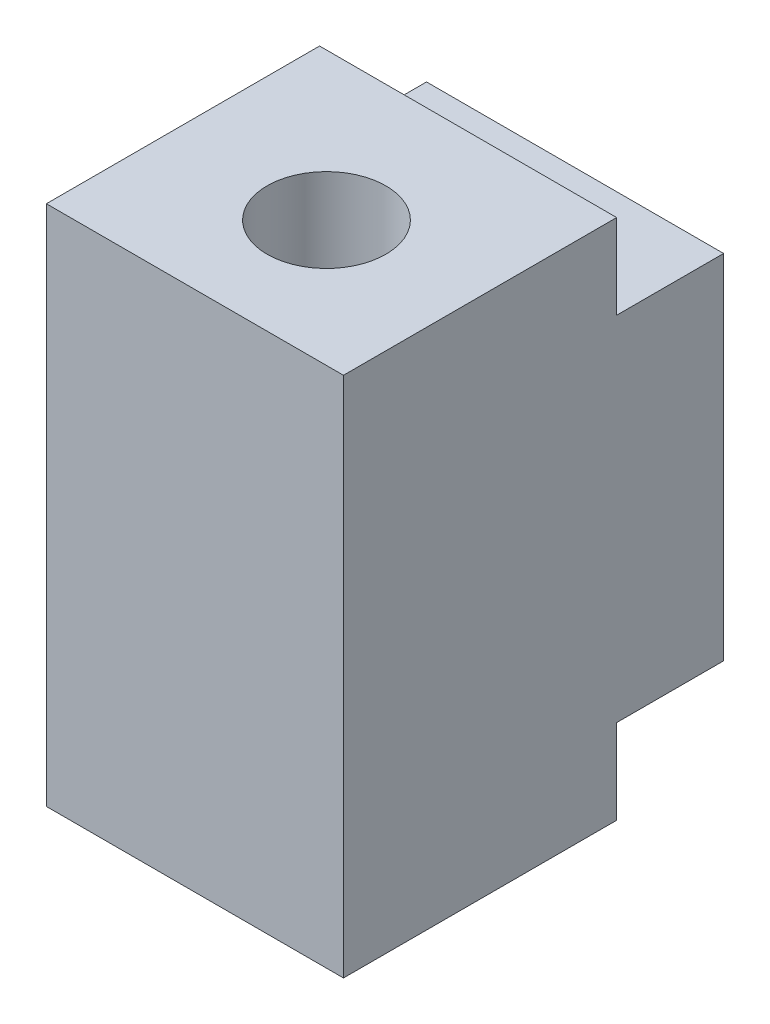
ISO-10303-21;
HEADER;
FILE_DESCRIPTION(('STEP AP214'),'2;1');
FILE_NAME('part.step','',(''),(''),'','','');
FILE_SCHEMA(('AUTOMOTIVE_DESIGN { 1 0 10303 214 1 1 1 1 }'));
ENDSEC;
DATA;
#1=APPLICATION_CONTEXT('core data for automotive mechanical design processes');
#2=APPLICATION_PROTOCOL_DEFINITION('international standard','automotive_design',2000,#1);
#3=PRODUCT_CONTEXT('',#1,'mechanical');
#4=PRODUCT('Part','Part','',(#3));
#5=PRODUCT_RELATED_PRODUCT_CATEGORY('part','',(#4));
#6=PRODUCT_DEFINITION_FORMATION('','',#4);
#7=PRODUCT_DEFINITION_CONTEXT('part definition',#1,'design');
#8=PRODUCT_DEFINITION('design','',#6,#7);
#9=PRODUCT_DEFINITION_SHAPE('','',#8);
#10=(LENGTH_UNIT() NAMED_UNIT(*) SI_UNIT(.MILLI.,.METRE.));
#11=(NAMED_UNIT(*) PLANE_ANGLE_UNIT() SI_UNIT($,.RADIAN.));
#12=(NAMED_UNIT(*) SI_UNIT($,.STERADIAN.) SOLID_ANGLE_UNIT());
#13=UNCERTAINTY_MEASURE_WITH_UNIT(LENGTH_MEASURE(1.E-05),#10,'distance_accuracy_value','');
#14=(GEOMETRIC_REPRESENTATION_CONTEXT(3) GLOBAL_UNCERTAINTY_ASSIGNED_CONTEXT((#13)) GLOBAL_UNIT_ASSIGNED_CONTEXT((#10,
#11,#12)) REPRESENTATION_CONTEXT('',''));
#15=CARTESIAN_POINT('',(0.,0.,0.));
#16=DIRECTION('',(0.,0.,1.));
#17=DIRECTION('',(1.,0.,0.));
#18=AXIS2_PLACEMENT_3D('',#15,#16,#17);
#19=CARTESIAN_POINT('',(-12.4056934631671,-14.1873984347729,30.));
#20=DIRECTION('',(1.,0.,0.));
#21=DIRECTION('',(0.,0.,-1.));
#22=AXIS2_PLACEMENT_3D('',#19,#20,#21);
#23=PLANE('',#22);
#24=DIRECTION('',(0.,0.,-1.));
#25=VECTOR('',#24,1.);
#26=CARTESIAN_POINT('',(-12.4056934631671,-14.1873984347729,30.));
#27=LINE('',#26,#25);
#28=CARTESIAN_POINT('',(-12.4056934631671,-14.1873984347729,8.60586466410496));
#29=VERTEX_POINT('',#28);
#30=CARTESIAN_POINT('',(-12.4056934631671,-14.1873984347729,0.));
#31=VERTEX_POINT('',#30);
#32=EDGE_CURVE('E52',#29,#31,#27,.T.);
#33=ORIENTED_EDGE('',*,*,#32,.F.);
#34=DIRECTION('',(0.,1.,0.));
#35=VECTOR('',#34,1.);
#36=CARTESIAN_POINT('',(-12.4056934631671,21.0063007826136,8.60586466410496));
#37=LINE('',#36,#35);
#38=CARTESIAN_POINT('',(-12.4056934631671,-20.9936992173865,8.60586466410496));
#39=VERTEX_POINT('',#38);
#40=EDGE_CURVE('E126',#39,#29,#37,.T.);
#41=ORIENTED_EDGE('',*,*,#40,.F.);
#42=DIRECTION('',(0.,0.,-1.));
#43=VECTOR('',#42,1.);
#44=CARTESIAN_POINT('',(-12.4056934631671,-20.9936992173865,30.5867015679695));
#45=LINE('',#44,#43);
#46=CARTESIAN_POINT('',(-12.4056934631671,-20.9936992173865,30.5867015679695));
#47=VERTEX_POINT('',#46);
#48=EDGE_CURVE('E109',#47,#39,#45,.T.);
#49=ORIENTED_EDGE('',*,*,#48,.F.);
#50=DIRECTION('',(0.,-1.,0.));
#51=VECTOR('',#50,1.);
#52=CARTESIAN_POINT('',(-12.4056934631671,21.0063007826136,30.5867015679695));
#53=LINE('',#52,#51);
#54=CARTESIAN_POINT('',(-12.4056934631671,21.0063007826136,30.5867015679695));
#55=VERTEX_POINT('',#54);
#56=EDGE_CURVE('E123',#55,#47,#53,.T.);
#57=ORIENTED_EDGE('',*,*,#56,.F.);
#58=DIRECTION('',(0.,0.,1.));
#59=VECTOR('',#58,1.);
#60=CARTESIAN_POINT('',(-12.4056934631671,21.0063007826136,30.5867015679695));
#61=LINE('',#60,#59);
#62=CARTESIAN_POINT('',(-12.4056934631671,21.0063007826136,8.60586466410496));
#63=VERTEX_POINT('',#62);
#64=EDGE_CURVE('E117',#63,#55,#61,.T.);
#65=ORIENTED_EDGE('',*,*,#64,.F.);
#66=CARTESIAN_POINT('',(-12.4056934631671,14.2,8.60586466410496));
#67=VERTEX_POINT('',#66);
#68=EDGE_CURVE('E127',#67,#63,#37,.T.);
#69=ORIENTED_EDGE('',*,*,#68,.F.);
#70=DIRECTION('',(0.,0.,-1.));
#71=VECTOR('',#70,1.);
#72=CARTESIAN_POINT('',(-12.4056934631671,14.2,30.));
#73=LINE('',#72,#71);
#74=CARTESIAN_POINT('',(-12.4056934631671,14.2,0.));
#75=VERTEX_POINT('',#74);
#76=EDGE_CURVE('E166',#67,#75,#73,.T.);
#77=ORIENTED_EDGE('',*,*,#76,.T.);
#78=DIRECTION('',(0.,-1.,0.));
#79=VECTOR('',#78,1.);
#80=CARTESIAN_POINT('',(-12.4056934631671,-14.1873984347729,0.));
#81=LINE('',#80,#79);
#82=EDGE_CURVE('E155',#75,#31,#81,.T.);
#83=ORIENTED_EDGE('',*,*,#82,.T.);
#84=EDGE_LOOP('',(#33,#41,#49,#57,#65,#69,#77,#83));
#85=FACE_BOUND('',#84,.T.);
#86=ADVANCED_FACE('F45',(#85),#23,.F.);
#87=CARTESIAN_POINT('',(-12.4056934631671,-14.1873984347729,30.));
#88=DIRECTION('',(0.,1.,0.));
#89=DIRECTION('',(0.,0.,1.));
#90=AXIS2_PLACEMENT_3D('',#87,#88,#89);
#91=PLANE('',#90);
#92=DIRECTION('',(0.,0.,-1.));
#93=VECTOR('',#92,1.);
#94=CARTESIAN_POINT('',(11.5,-14.1873984347729,30.));
#95=LINE('',#94,#93);
#96=CARTESIAN_POINT('',(11.5,-14.1873984347729,8.60586466410496));
#97=VERTEX_POINT('',#96);
#98=CARTESIAN_POINT('',(11.5,-14.1873984347729,0.));
#99=VERTEX_POINT('',#98);
#100=EDGE_CURVE('E64',#97,#99,#95,.T.);
#101=ORIENTED_EDGE('',*,*,#100,.F.);
#102=DIRECTION('',(-1.,0.,0.));
#103=VECTOR('',#102,1.);
#104=CARTESIAN_POINT('',(-12.4056934631671,-14.1873984347729,8.60586466410496));
#105=LINE('',#104,#103);
#106=EDGE_CURVE('E59',#97,#29,#105,.T.);
#107=ORIENTED_EDGE('',*,*,#106,.T.);
#108=ORIENTED_EDGE('',*,*,#32,.T.);
#109=DIRECTION('',(1.,0.,0.));
#110=VECTOR('',#109,1.);
#111=CARTESIAN_POINT('',(-12.4056934631671,-14.1873984347729,0.));
#112=LINE('',#111,#110);
#113=EDGE_CURVE('E158',#31,#99,#112,.T.);
#114=ORIENTED_EDGE('',*,*,#113,.T.);
#115=EDGE_LOOP('',(#101,#107,#108,#114));
#116=FACE_BOUND('',#115,.T.);
#117=ADVANCED_FACE('F171',(#116),#91,.F.);
#118=CARTESIAN_POINT('',(11.5,-14.1873984347729,30.));
#119=DIRECTION('',(-1.,0.,0.));
#120=DIRECTION('',(0.,-1.,0.));
#121=AXIS2_PLACEMENT_3D('',#118,#119,#120);
#122=PLANE('',#121);
#123=DIRECTION('',(0.,1.,0.));
#124=VECTOR('',#123,1.);
#125=CARTESIAN_POINT('',(11.5,21.0063007826136,8.60586466410496));
#126=LINE('',#125,#124);
#127=CARTESIAN_POINT('',(11.5,-20.9936992173865,8.60586466410496));
#128=VERTEX_POINT('',#127);
#129=EDGE_CURVE('E134',#128,#97,#126,.T.);
#130=ORIENTED_EDGE('',*,*,#129,.T.);
#131=ORIENTED_EDGE('',*,*,#100,.T.);
#132=DIRECTION('',(0.,1.,0.));
#133=VECTOR('',#132,1.);
#134=CARTESIAN_POINT('',(11.5,-14.1873984347729,0.));
#135=LINE('',#134,#133);
#136=CARTESIAN_POINT('',(11.5,14.2,0.));
#137=VERTEX_POINT('',#136);
#138=EDGE_CURVE('E160',#99,#137,#135,.T.);
#139=ORIENTED_EDGE('',*,*,#138,.T.);
#140=DIRECTION('',(0.,0.,-1.));
#141=VECTOR('',#140,1.);
#142=CARTESIAN_POINT('',(11.5,14.2,30.));
#143=LINE('',#142,#141);
#144=CARTESIAN_POINT('',(11.5,14.2,8.60586466410496));
#145=VERTEX_POINT('',#144);
#146=EDGE_CURVE('E168',#145,#137,#143,.T.);
#147=ORIENTED_EDGE('',*,*,#146,.F.);
#148=CARTESIAN_POINT('',(11.5,21.0063007826136,8.60586466410496));
#149=VERTEX_POINT('',#148);
#150=EDGE_CURVE('E146',#145,#149,#126,.T.);
#151=ORIENTED_EDGE('',*,*,#150,.T.);
#152=DIRECTION('',(0.,0.,1.));
#153=VECTOR('',#152,1.);
#154=CARTESIAN_POINT('',(11.5,21.0063007826136,30.5867015679695));
#155=LINE('',#154,#153);
#156=CARTESIAN_POINT('',(11.5,21.0063007826136,30.5867015679695));
#157=VERTEX_POINT('',#156);
#158=EDGE_CURVE('E131',#149,#157,#155,.T.);
#159=ORIENTED_EDGE('',*,*,#158,.T.);
#160=DIRECTION('',(0.,-1.,0.));
#161=VECTOR('',#160,1.);
#162=CARTESIAN_POINT('',(11.5,21.0063007826136,30.5867015679695));
#163=LINE('',#162,#161);
#164=CARTESIAN_POINT('',(11.5,-20.9936992173865,30.5867015679695));
#165=VERTEX_POINT('',#164);
#166=EDGE_CURVE('E142',#157,#165,#163,.T.);
#167=ORIENTED_EDGE('',*,*,#166,.T.);
#168=DIRECTION('',(0.,0.,-1.));
#169=VECTOR('',#168,1.);
#170=CARTESIAN_POINT('',(11.5,-20.9936992173865,30.5867015679695));
#171=LINE('',#170,#169);
#172=EDGE_CURVE('E111',#165,#128,#171,.T.);
#173=ORIENTED_EDGE('',*,*,#172,.T.);
#174=EDGE_LOOP('',(#130,#131,#139,#147,#151,#159,#167,#173));
#175=FACE_BOUND('',#174,.T.);
#176=ADVANCED_FACE('F184',(#175),#122,.F.);
#177=CARTESIAN_POINT('',(-12.4056934631671,14.2,30.));
#178=DIRECTION('',(0.,-1.,0.));
#179=DIRECTION('',(0.,0.,-1.));
#180=AXIS2_PLACEMENT_3D('',#177,#178,#179);
#181=PLANE('',#180);
#182=ORIENTED_EDGE('',*,*,#76,.F.);
#183=DIRECTION('',(1.,0.,0.));
#184=VECTOR('',#183,1.);
#185=CARTESIAN_POINT('',(-12.4056934631671,14.2,8.60586466410496));
#186=LINE('',#185,#184);
#187=EDGE_CURVE('E13',#67,#145,#186,.T.);
#188=ORIENTED_EDGE('',*,*,#187,.T.);
#189=ORIENTED_EDGE('',*,*,#146,.T.);
#190=DIRECTION('',(-1.,0.,0.));
#191=VECTOR('',#190,1.);
#192=CARTESIAN_POINT('',(-12.4056934631671,14.2,0.));
#193=LINE('',#192,#191);
#194=EDGE_CURVE('E163',#137,#75,#193,.T.);
#195=ORIENTED_EDGE('',*,*,#194,.T.);
#196=EDGE_LOOP('',(#182,#188,#189,#195));
#197=FACE_BOUND('',#196,.T.);
#198=ADVANCED_FACE('F180',(#197),#181,.F.);
#199=CARTESIAN_POINT('',(0.,0.,0.));
#200=DIRECTION('',(0.,0.,-1.));
#201=DIRECTION('',(-1.,0.,0.));
#202=AXIS2_PLACEMENT_3D('',#199,#200,#201);
#203=PLANE('',#202);
#204=ORIENTED_EDGE('',*,*,#82,.F.);
#205=ORIENTED_EDGE('',*,*,#194,.F.);
#206=ORIENTED_EDGE('',*,*,#138,.F.);
#207=ORIENTED_EDGE('',*,*,#113,.F.);
#208=EDGE_LOOP('',(#204,#205,#206,#207));
#209=FACE_BOUND('',#208,.T.);
#210=ADVANCED_FACE('F175',(#209),#203,.T.);
#211=CARTESIAN_POINT('',(-12.4056934631671,21.0063007826136,8.60586466410496));
#212=DIRECTION('',(0.,0.,-1.));
#213=DIRECTION('',(0.,1.,0.));
#214=AXIS2_PLACEMENT_3D('',#211,#212,#213);
#215=PLANE('',#214);
#216=ORIENTED_EDGE('',*,*,#106,.F.);
#217=ORIENTED_EDGE('',*,*,#129,.F.);
#218=DIRECTION('',(1.,0.,0.));
#219=VECTOR('',#218,1.);
#220=CARTESIAN_POINT('',(-12.4056934631671,-20.9936992173865,8.60586466410496));
#221=LINE('',#220,#219);
#222=EDGE_CURVE('E116',#39,#128,#221,.T.);
#223=ORIENTED_EDGE('',*,*,#222,.F.);
#224=ORIENTED_EDGE('',*,*,#40,.T.);
#225=EDGE_LOOP('',(#216,#217,#223,#224));
#226=FACE_BOUND('',#225,.T.);
#227=ADVANCED_FACE('F187',(#226),#215,.T.);
#228=ORIENTED_EDGE('',*,*,#187,.F.);
#229=ORIENTED_EDGE('',*,*,#68,.T.);
#230=DIRECTION('',(1.,0.,0.));
#231=VECTOR('',#230,1.);
#232=CARTESIAN_POINT('',(-12.4056934631671,21.0063007826136,8.60586466410496));
#233=LINE('',#232,#231);
#234=EDGE_CURVE('E150',#63,#149,#233,.T.);
#235=ORIENTED_EDGE('',*,*,#234,.T.);
#236=ORIENTED_EDGE('',*,*,#150,.F.);
#237=EDGE_LOOP('',(#228,#229,#235,#236));
#238=FACE_BOUND('',#237,.T.);
#239=ADVANCED_FACE('F189',(#238),#215,.T.);
#240=CARTESIAN_POINT('',(-12.4056934631671,21.0063007826136,30.5867015679695));
#241=DIRECTION('',(0.,0.,1.));
#242=DIRECTION('',(0.,-1.,0.));
#243=AXIS2_PLACEMENT_3D('',#240,#241,#242);
#244=PLANE('',#243);
#245=ORIENTED_EDGE('',*,*,#166,.F.);
#246=DIRECTION('',(1.,0.,0.));
#247=VECTOR('',#246,1.);
#248=CARTESIAN_POINT('',(-12.4056934631671,21.0063007826136,30.5867015679695));
#249=LINE('',#248,#247);
#250=EDGE_CURVE('E130',#55,#157,#249,.T.);
#251=ORIENTED_EDGE('',*,*,#250,.F.);
#252=ORIENTED_EDGE('',*,*,#56,.T.);
#253=DIRECTION('',(1.,0.,0.));
#254=VECTOR('',#253,1.);
#255=CARTESIAN_POINT('',(-12.4056934631671,-20.9936992173865,30.5867015679695));
#256=LINE('',#255,#254);
#257=EDGE_CURVE('E106',#47,#165,#256,.T.);
#258=ORIENTED_EDGE('',*,*,#257,.T.);
#259=EDGE_LOOP('',(#245,#251,#252,#258));
#260=FACE_BOUND('',#259,.T.);
#261=ADVANCED_FACE('F129',(#260),#244,.T.);
#262=CARTESIAN_POINT('',(-12.4056934631671,21.0063007826136,30.5867015679695));
#263=DIRECTION('',(0.,1.,0.));
#264=DIRECTION('',(0.,0.,1.));
#265=AXIS2_PLACEMENT_3D('',#262,#263,#264);
#266=PLANE('',#265);
#267=CARTESIAN_POINT('',(0.,21.0063007826136,20.4542492118236));
#268=DIRECTION('',(0.,1.,0.));
#269=DIRECTION('',(0.,0.,1.));
#270=AXIS2_PLACEMENT_3D('',#267,#268,#269);
#271=CIRCLE('',#270,4.77594637766629);
#272=CARTESIAN_POINT('',(0.,21.0063007826136,25.2301955894899));
#273=VERTEX_POINT('',#272);
#274=EDGE_CURVE('E137',#273,#273,#271,.T.);
#275=ORIENTED_EDGE('',*,*,#274,.F.);
#276=EDGE_LOOP('',(#275));
#277=FACE_BOUND('',#276,.T.);
#278=ORIENTED_EDGE('',*,*,#158,.F.);
#279=ORIENTED_EDGE('',*,*,#234,.F.);
#280=ORIENTED_EDGE('',*,*,#64,.T.);
#281=ORIENTED_EDGE('',*,*,#250,.T.);
#282=EDGE_LOOP('',(#278,#279,#280,#281));
#283=FACE_BOUND('',#282,.T.);
#284=ADVANCED_FACE('F211',(#277,#283),#266,.T.);
#285=CARTESIAN_POINT('',(-12.4056934631671,-20.9936992173865,30.5867015679695));
#286=DIRECTION('',(0.,-1.,0.));
#287=DIRECTION('',(0.,0.,-1.));
#288=AXIS2_PLACEMENT_3D('',#285,#286,#287);
#289=PLANE('',#288);
#290=CARTESIAN_POINT('',(0.,-20.9936992173864,20.4542492118236));
#291=DIRECTION('',(0.,1.,0.));
#292=DIRECTION('',(0.,0.,1.));
#293=AXIS2_PLACEMENT_3D('',#290,#291,#292);
#294=CIRCLE('',#293,4.77594637766629);
#295=CARTESIAN_POINT('',(0.,-20.9936992173864,25.2301955894899));
#296=VERTEX_POINT('',#295);
#297=EDGE_CURVE('E144',#296,#296,#294,.T.);
#298=ORIENTED_EDGE('',*,*,#297,.T.);
#299=EDGE_LOOP('',(#298));
#300=FACE_BOUND('',#299,.T.);
#301=ORIENTED_EDGE('',*,*,#172,.F.);
#302=ORIENTED_EDGE('',*,*,#257,.F.);
#303=ORIENTED_EDGE('',*,*,#48,.T.);
#304=ORIENTED_EDGE('',*,*,#222,.T.);
#305=EDGE_LOOP('',(#301,#302,#303,#304));
#306=FACE_BOUND('',#305,.T.);
#307=ADVANCED_FACE('F108',(#300,#306),#289,.T.);
#308=CARTESIAN_POINT('',(0.,-20.9936992173864,20.4542492118236));
#309=DIRECTION('',(0.,1.,0.));
#310=DIRECTION('',(0.,0.,1.));
#311=AXIS2_PLACEMENT_3D('',#308,#309,#310);
#312=CYLINDRICAL_SURFACE('',#311,4.77594637766629);
#313=ORIENTED_EDGE('',*,*,#297,.F.);
#314=EDGE_LOOP('',(#313));
#315=FACE_BOUND('',#314,.T.);
#316=ORIENTED_EDGE('',*,*,#274,.T.);
#317=EDGE_LOOP('',(#316));
#318=FACE_BOUND('',#317,.T.);
#319=ADVANCED_FACE('F213',(#315,#318),#312,.F.);
#320=CLOSED_SHELL('',(#86,#117,#176,#198,#210,#227,#239,#261,#284,#307,#319));
#321=MANIFOLD_SOLID_BREP('B2',#320);
#322=ADVANCED_BREP_SHAPE_REPRESENTATION('',(#18,#321),#14);
#323=SHAPE_DEFINITION_REPRESENTATION(#9,#322);
ENDSEC;
END-ISO-10303-21;
